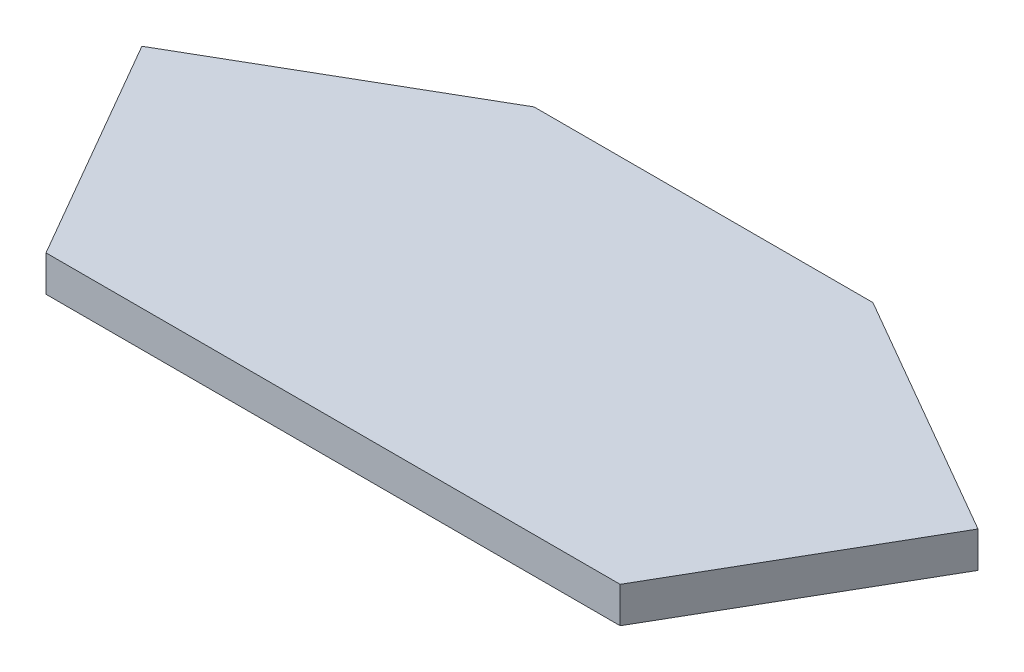
ISO-10303-21;
HEADER;
FILE_DESCRIPTION(('STEP AP214'),'2;1');
FILE_NAME('part.step','',(''),(''),'','','');
FILE_SCHEMA(('AUTOMOTIVE_DESIGN { 1 0 10303 214 1 1 1 1 }'));
ENDSEC;
DATA;
#1=APPLICATION_CONTEXT('core data for automotive mechanical design processes');
#2=APPLICATION_PROTOCOL_DEFINITION('international standard','automotive_design',2000,#1);
#3=PRODUCT_CONTEXT('',#1,'mechanical');
#4=PRODUCT('Part','Part','',(#3));
#5=PRODUCT_RELATED_PRODUCT_CATEGORY('part','',(#4));
#6=PRODUCT_DEFINITION_FORMATION('','',#4);
#7=PRODUCT_DEFINITION_CONTEXT('part definition',#1,'design');
#8=PRODUCT_DEFINITION('design','',#6,#7);
#9=PRODUCT_DEFINITION_SHAPE('','',#8);
#10=(LENGTH_UNIT() NAMED_UNIT(*) SI_UNIT(.MILLI.,.METRE.));
#11=(NAMED_UNIT(*) PLANE_ANGLE_UNIT() SI_UNIT($,.RADIAN.));
#12=(NAMED_UNIT(*) SI_UNIT($,.STERADIAN.) SOLID_ANGLE_UNIT());
#13=UNCERTAINTY_MEASURE_WITH_UNIT(LENGTH_MEASURE(1.E-05),#10,'distance_accuracy_value','');
#14=(GEOMETRIC_REPRESENTATION_CONTEXT(3) GLOBAL_UNCERTAINTY_ASSIGNED_CONTEXT((#13)) GLOBAL_UNIT_ASSIGNED_CONTEXT((#10,
#11,#12)) REPRESENTATION_CONTEXT('',''));
#15=CARTESIAN_POINT('',(0.,0.,0.));
#16=DIRECTION('',(0.,0.,1.));
#17=DIRECTION('',(1.,0.,0.));
#18=AXIS2_PLACEMENT_3D('',#15,#16,#17);
#19=CARTESIAN_POINT('',(80.,10.,0.));
#20=DIRECTION('',(-0.86602540378444,0.,-0.499999999999998));
#21=DIRECTION('',(-0.499999999999998,0.,0.86602540378444));
#22=AXIS2_PLACEMENT_3D('',#19,#20,#21);
#23=PLANE('',#22);
#24=DIRECTION('',(0.499999999999998,0.,-0.86602540378444));
#25=VECTOR('',#24,1.);
#26=CARTESIAN_POINT('',(80.,0.,0.));
#27=LINE('',#26,#25);
#28=CARTESIAN_POINT('',(80.,0.,0.));
#29=VERTEX_POINT('',#28);
#30=CARTESIAN_POINT('',(116.5,0.,-63.2198544762637));
#31=VERTEX_POINT('',#30);
#32=EDGE_CURVE('E134',#29,#31,#27,.T.);
#33=ORIENTED_EDGE('',*,*,#32,.T.);
#34=DIRECTION('',(0.,-1.,0.));
#35=VECTOR('',#34,1.);
#36=CARTESIAN_POINT('',(116.5,10.,-63.2198544762637));
#37=LINE('',#36,#35);
#38=CARTESIAN_POINT('',(116.5,10.,-63.2198544762637));
#39=VERTEX_POINT('',#38);
#40=EDGE_CURVE('E11',#39,#31,#37,.T.);
#41=ORIENTED_EDGE('',*,*,#40,.F.);
#42=DIRECTION('',(0.499999999999998,0.,-0.86602540378444));
#43=VECTOR('',#42,1.);
#44=CARTESIAN_POINT('',(80.,10.,0.));
#45=LINE('',#44,#43);
#46=CARTESIAN_POINT('',(80.,10.,0.));
#47=VERTEX_POINT('',#46);
#48=EDGE_CURVE('E150',#47,#39,#45,.T.);
#49=ORIENTED_EDGE('',*,*,#48,.F.);
#50=DIRECTION('',(0.,-1.,0.));
#51=VECTOR('',#50,1.);
#52=CARTESIAN_POINT('',(80.,10.,0.));
#53=LINE('',#52,#51);
#54=EDGE_CURVE('E130',#47,#29,#53,.T.);
#55=ORIENTED_EDGE('',*,*,#54,.T.);
#56=EDGE_LOOP('',(#33,#41,#49,#55));
#57=FACE_BOUND('',#56,.T.);
#58=ADVANCED_FACE('F45',(#57),#23,.F.);
#59=CARTESIAN_POINT('',(116.5,10.,-63.2198544762637));
#60=DIRECTION('',(-0.499999999999998,0.,0.86602540378444));
#61=DIRECTION('',(0.86602540378444,0.,0.499999999999998));
#62=AXIS2_PLACEMENT_3D('',#59,#60,#61);
#63=PLANE('',#62);
#64=DIRECTION('',(-0.86602540378444,0.,-0.499999999999998));
#65=VECTOR('',#64,1.);
#66=CARTESIAN_POINT('',(116.5,0.,-63.2198544762637));
#67=LINE('',#66,#65);
#68=CARTESIAN_POINT('',(47.2179676972439,0.,-103.219854476264));
#69=VERTEX_POINT('',#68);
#70=EDGE_CURVE('E138',#31,#69,#67,.T.);
#71=ORIENTED_EDGE('',*,*,#70,.T.);
#72=DIRECTION('',(0.,-1.,0.));
#73=VECTOR('',#72,1.);
#74=CARTESIAN_POINT('',(47.2179676972439,10.,-103.219854476264));
#75=LINE('',#74,#73);
#76=CARTESIAN_POINT('',(47.2179676972439,10.,-103.219854476264));
#77=VERTEX_POINT('',#76);
#78=EDGE_CURVE('E54',#77,#69,#75,.T.);
#79=ORIENTED_EDGE('',*,*,#78,.F.);
#80=DIRECTION('',(-0.86602540378444,0.,-0.499999999999998));
#81=VECTOR('',#80,1.);
#82=CARTESIAN_POINT('',(116.5,10.,-63.2198544762637));
#83=LINE('',#82,#81);
#84=EDGE_CURVE('E99',#39,#77,#83,.T.);
#85=ORIENTED_EDGE('',*,*,#84,.F.);
#86=ORIENTED_EDGE('',*,*,#40,.T.);
#87=EDGE_LOOP('',(#71,#79,#85,#86));
#88=FACE_BOUND('',#87,.T.);
#89=ADVANCED_FACE('F178',(#88),#63,.F.);
#90=CARTESIAN_POINT('',(47.2179676972439,10.,-103.219854476264));
#91=DIRECTION('',(0.,0.,1.));
#92=DIRECTION('',(1.,0.,0.));
#93=AXIS2_PLACEMENT_3D('',#90,#91,#92);
#94=PLANE('',#93);
#95=DIRECTION('',(-1.,0.,0.));
#96=VECTOR('',#95,1.);
#97=CARTESIAN_POINT('',(47.2179676972439,0.,-103.219854476264));
#98=LINE('',#97,#96);
#99=CARTESIAN_POINT('',(-47.2179676972449,0.,-103.219854476264));
#100=VERTEX_POINT('',#99);
#101=EDGE_CURVE('E141',#69,#100,#98,.T.);
#102=ORIENTED_EDGE('',*,*,#101,.T.);
#103=DIRECTION('',(0.,-1.,0.));
#104=VECTOR('',#103,1.);
#105=CARTESIAN_POINT('',(-47.2179676972449,10.,-103.219854476264));
#106=LINE('',#105,#104);
#107=CARTESIAN_POINT('',(-47.2179676972449,10.,-103.219854476264));
#108=VERTEX_POINT('',#107);
#109=EDGE_CURVE('E123',#108,#100,#106,.T.);
#110=ORIENTED_EDGE('',*,*,#109,.F.);
#111=DIRECTION('',(-1.,0.,0.));
#112=VECTOR('',#111,1.);
#113=CARTESIAN_POINT('',(47.2179676972439,10.,-103.219854476264));
#114=LINE('',#113,#112);
#115=EDGE_CURVE('E112',#77,#108,#114,.T.);
#116=ORIENTED_EDGE('',*,*,#115,.F.);
#117=ORIENTED_EDGE('',*,*,#78,.T.);
#118=EDGE_LOOP('',(#102,#110,#116,#117));
#119=FACE_BOUND('',#118,.T.);
#120=ADVANCED_FACE('F160',(#119),#94,.F.);
#121=CARTESIAN_POINT('',(-116.5,10.,-63.2198544762644));
#122=DIRECTION('',(0.499999999999998,0.,0.86602540378444));
#123=DIRECTION('',(0.86602540378444,0.,-0.499999999999998));
#124=AXIS2_PLACEMENT_3D('',#121,#122,#123);
#125=PLANE('',#124);
#126=DIRECTION('',(-0.86602540378444,0.,0.499999999999998));
#127=VECTOR('',#126,1.);
#128=CARTESIAN_POINT('',(-116.5,0.,-63.2198544762644));
#129=LINE('',#128,#127);
#130=CARTESIAN_POINT('',(-116.5,0.,-63.2198544762644));
#131=VERTEX_POINT('',#130);
#132=EDGE_CURVE('E121',#100,#131,#129,.T.);
#133=ORIENTED_EDGE('',*,*,#132,.T.);
#134=DIRECTION('',(0.,-1.,0.));
#135=VECTOR('',#134,1.);
#136=CARTESIAN_POINT('',(-116.5,10.,-63.2198544762644));
#137=LINE('',#136,#135);
#138=CARTESIAN_POINT('',(-116.5,10.,-63.2198544762644));
#139=VERTEX_POINT('',#138);
#140=EDGE_CURVE('E118',#139,#131,#137,.T.);
#141=ORIENTED_EDGE('',*,*,#140,.F.);
#142=DIRECTION('',(-0.86602540378444,0.,0.499999999999998));
#143=VECTOR('',#142,1.);
#144=CARTESIAN_POINT('',(-116.5,10.,-63.2198544762644));
#145=LINE('',#144,#143);
#146=EDGE_CURVE('E106',#108,#139,#145,.T.);
#147=ORIENTED_EDGE('',*,*,#146,.F.);
#148=ORIENTED_EDGE('',*,*,#109,.T.);
#149=EDGE_LOOP('',(#133,#141,#147,#148));
#150=FACE_BOUND('',#149,.T.);
#151=ADVANCED_FACE('F119',(#150),#125,.F.);
#152=CARTESIAN_POINT('',(-80.,10.,0.));
#153=DIRECTION('',(0.86602540378444,0.,-0.499999999999998));
#154=DIRECTION('',(-0.499999999999998,0.,-0.86602540378444));
#155=AXIS2_PLACEMENT_3D('',#152,#153,#154);
#156=PLANE('',#155);
#157=DIRECTION('',(0.499999999999998,0.,0.86602540378444));
#158=VECTOR('',#157,1.);
#159=CARTESIAN_POINT('',(-80.,0.,0.));
#160=LINE('',#159,#158);
#161=CARTESIAN_POINT('',(-80.,0.,0.));
#162=VERTEX_POINT('',#161);
#163=EDGE_CURVE('E85',#131,#162,#160,.T.);
#164=ORIENTED_EDGE('',*,*,#163,.T.);
#165=DIRECTION('',(0.,-1.,0.));
#166=VECTOR('',#165,1.);
#167=CARTESIAN_POINT('',(-80.,10.,0.));
#168=LINE('',#167,#166);
#169=CARTESIAN_POINT('',(-80.,10.,0.));
#170=VERTEX_POINT('',#169);
#171=EDGE_CURVE('E124',#170,#162,#168,.T.);
#172=ORIENTED_EDGE('',*,*,#171,.F.);
#173=DIRECTION('',(0.499999999999998,0.,0.86602540378444));
#174=VECTOR('',#173,1.);
#175=CARTESIAN_POINT('',(-80.,10.,0.));
#176=LINE('',#175,#174);
#177=EDGE_CURVE('E110',#139,#170,#176,.T.);
#178=ORIENTED_EDGE('',*,*,#177,.F.);
#179=ORIENTED_EDGE('',*,*,#140,.T.);
#180=EDGE_LOOP('',(#164,#172,#178,#179));
#181=FACE_BOUND('',#180,.T.);
#182=ADVANCED_FACE('F126',(#181),#156,.F.);
#183=CARTESIAN_POINT('',(-80.,10.,0.));
#184=DIRECTION('',(0.,0.,-1.));
#185=DIRECTION('',(-1.,0.,0.));
#186=AXIS2_PLACEMENT_3D('',#183,#184,#185);
#187=PLANE('',#186);
#188=DIRECTION('',(1.,0.,0.));
#189=VECTOR('',#188,1.);
#190=CARTESIAN_POINT('',(-80.,0.,0.));
#191=LINE('',#190,#189);
#192=EDGE_CURVE('E91',#162,#29,#191,.T.);
#193=ORIENTED_EDGE('',*,*,#192,.T.);
#194=ORIENTED_EDGE('',*,*,#54,.F.);
#195=DIRECTION('',(1.,0.,0.));
#196=VECTOR('',#195,1.);
#197=CARTESIAN_POINT('',(-80.,10.,0.));
#198=LINE('',#197,#196);
#199=EDGE_CURVE('E62',#170,#47,#198,.T.);
#200=ORIENTED_EDGE('',*,*,#199,.F.);
#201=ORIENTED_EDGE('',*,*,#171,.T.);
#202=EDGE_LOOP('',(#193,#194,#200,#201));
#203=FACE_BOUND('',#202,.T.);
#204=ADVANCED_FACE('F167',(#203),#187,.F.);
#205=CARTESIAN_POINT('',(0.,10.,0.));
#206=DIRECTION('',(0.,1.,0.));
#207=DIRECTION('',(0.,0.,1.));
#208=AXIS2_PLACEMENT_3D('',#205,#206,#207);
#209=PLANE('',#208);
#210=ORIENTED_EDGE('',*,*,#48,.T.);
#211=ORIENTED_EDGE('',*,*,#84,.T.);
#212=ORIENTED_EDGE('',*,*,#115,.T.);
#213=ORIENTED_EDGE('',*,*,#146,.T.);
#214=ORIENTED_EDGE('',*,*,#177,.T.);
#215=ORIENTED_EDGE('',*,*,#199,.T.);
#216=EDGE_LOOP('',(#210,#211,#212,#213,#214,#215));
#217=FACE_BOUND('',#216,.T.);
#218=ADVANCED_FACE('F108',(#217),#209,.T.);
#219=CARTESIAN_POINT('',(0.,0.,0.));
#220=DIRECTION('',(0.,1.,0.));
#221=DIRECTION('',(0.,0.,1.));
#222=AXIS2_PLACEMENT_3D('',#219,#220,#221);
#223=PLANE('',#222);
#224=ORIENTED_EDGE('',*,*,#32,.F.);
#225=ORIENTED_EDGE('',*,*,#192,.F.);
#226=ORIENTED_EDGE('',*,*,#163,.F.);
#227=ORIENTED_EDGE('',*,*,#132,.F.);
#228=ORIENTED_EDGE('',*,*,#101,.F.);
#229=ORIENTED_EDGE('',*,*,#70,.F.);
#230=EDGE_LOOP('',(#224,#225,#226,#227,#228,#229));
#231=FACE_BOUND('',#230,.T.);
#232=ADVANCED_FACE('F163',(#231),#223,.F.);
#233=CLOSED_SHELL('',(#58,#89,#120,#151,#182,#204,#218,#232));
#234=MANIFOLD_SOLID_BREP('B2',#233);
#235=ADVANCED_BREP_SHAPE_REPRESENTATION('',(#18,#234),#14);
#236=SHAPE_DEFINITION_REPRESENTATION(#9,#235);
ENDSEC;
END-ISO-10303-21;
